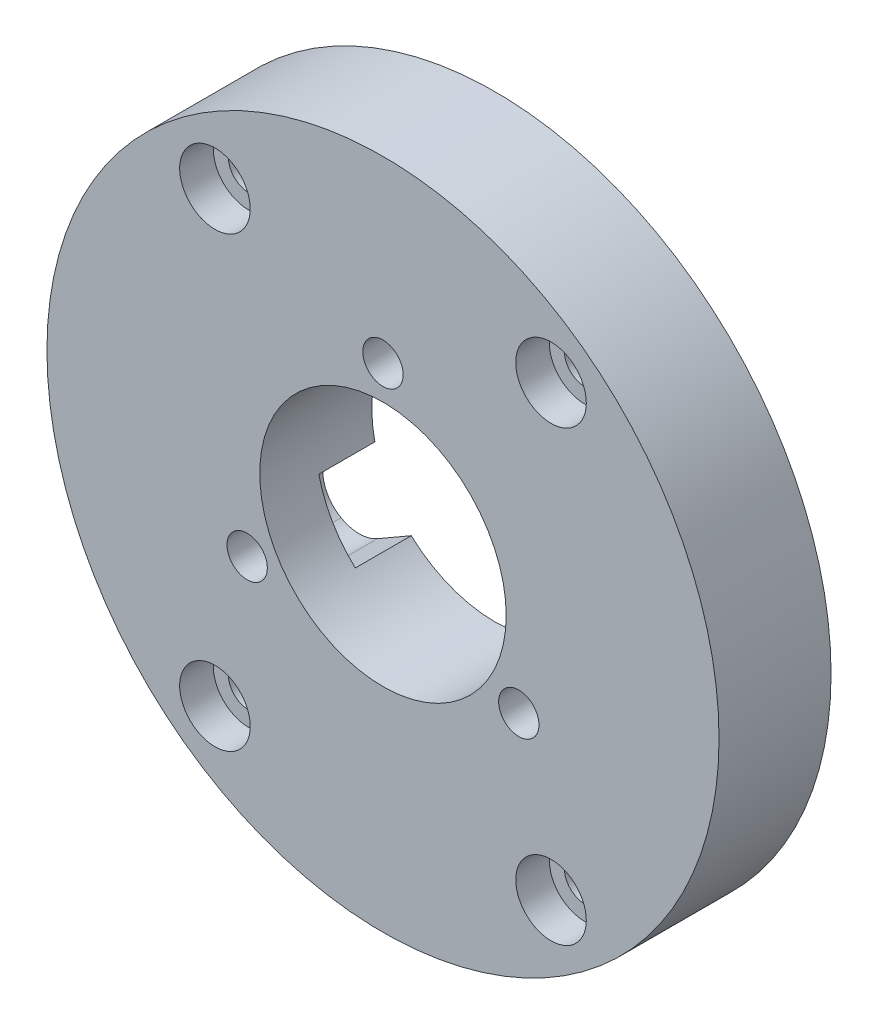
ISO-10303-21;
HEADER;
FILE_DESCRIPTION(('STEP AP214'),'2;1');
FILE_NAME('part.step','',(''),(''),'','','');
FILE_SCHEMA(('AUTOMOTIVE_DESIGN { 1 0 10303 214 1 1 1 1 }'));
ENDSEC;
DATA;
#1=APPLICATION_CONTEXT('core data for automotive mechanical design processes');
#2=APPLICATION_PROTOCOL_DEFINITION('international standard','automotive_design',2000,#1);
#3=PRODUCT_CONTEXT('',#1,'mechanical');
#4=PRODUCT('Part','Part','',(#3));
#5=PRODUCT_RELATED_PRODUCT_CATEGORY('part','',(#4));
#6=PRODUCT_DEFINITION_FORMATION('','',#4);
#7=PRODUCT_DEFINITION_CONTEXT('part definition',#1,'design');
#8=PRODUCT_DEFINITION('design','',#6,#7);
#9=PRODUCT_DEFINITION_SHAPE('','',#8);
#10=(LENGTH_UNIT() NAMED_UNIT(*) SI_UNIT(.MILLI.,.METRE.));
#11=(NAMED_UNIT(*) PLANE_ANGLE_UNIT() SI_UNIT($,.RADIAN.));
#12=(NAMED_UNIT(*) SI_UNIT($,.STERADIAN.) SOLID_ANGLE_UNIT());
#13=UNCERTAINTY_MEASURE_WITH_UNIT(LENGTH_MEASURE(1.E-05),#10,'distance_accuracy_value','');
#14=(GEOMETRIC_REPRESENTATION_CONTEXT(3) GLOBAL_UNCERTAINTY_ASSIGNED_CONTEXT((#13)) GLOBAL_UNIT_ASSIGNED_CONTEXT((#10,
#11,#12)) REPRESENTATION_CONTEXT('',''));
#15=CARTESIAN_POINT('',(0.,0.,0.));
#16=DIRECTION('',(0.,0.,1.));
#17=DIRECTION('',(1.,0.,0.));
#18=AXIS2_PLACEMENT_3D('',#15,#16,#17);
#19=CARTESIAN_POINT('',(0.,0.,0.));
#20=DIRECTION('',(0.,0.,1.));
#21=DIRECTION('',(1.,0.,0.));
#22=AXIS2_PLACEMENT_3D('',#19,#20,#21);
#23=PLANE('',#22);
#24=CARTESIAN_POINT('',(0.,0.,0.));
#25=DIRECTION('',(0.,0.,1.));
#26=DIRECTION('',(1.,0.,0.));
#27=AXIS2_PLACEMENT_3D('',#24,#25,#26);
#28=CIRCLE('',#27,30.);
#29=CARTESIAN_POINT('',(30.,0.,0.));
#30=VERTEX_POINT('',#29);
#31=EDGE_CURVE('E65',#30,#30,#28,.T.);
#32=ORIENTED_EDGE('',*,*,#31,.F.);
#33=EDGE_LOOP('',(#32));
#34=FACE_BOUND('',#33,.T.);
#35=CARTESIAN_POINT('',(15.,-20.,0.));
#36=DIRECTION('',(0.,0.,1.));
#37=DIRECTION('',(1.,0.,0.));
#38=AXIS2_PLACEMENT_3D('',#35,#36,#37);
#39=CIRCLE('',#38,1.8);
#40=CARTESIAN_POINT('',(16.8,-20.,0.));
#41=VERTEX_POINT('',#40);
#42=EDGE_CURVE('E288',#41,#41,#39,.F.);
#43=ORIENTED_EDGE('',*,*,#42,.F.);
#44=EDGE_LOOP('',(#43));
#45=FACE_BOUND('',#44,.T.);
#46=CARTESIAN_POINT('',(-15.,20.,0.));
#47=DIRECTION('',(0.,0.,1.));
#48=DIRECTION('',(1.,0.,0.));
#49=AXIS2_PLACEMENT_3D('',#46,#47,#48);
#50=CIRCLE('',#49,1.8);
#51=CARTESIAN_POINT('',(-13.2,20.,0.));
#52=VERTEX_POINT('',#51);
#53=EDGE_CURVE('E281',#52,#52,#50,.F.);
#54=ORIENTED_EDGE('',*,*,#53,.F.);
#55=EDGE_LOOP('',(#54));
#56=FACE_BOUND('',#55,.T.);
#57=CARTESIAN_POINT('',(15.,20.,0.));
#58=DIRECTION('',(0.,0.,1.));
#59=DIRECTION('',(1.,0.,0.));
#60=AXIS2_PLACEMENT_3D('',#57,#58,#59);
#61=CIRCLE('',#60,1.8);
#62=CARTESIAN_POINT('',(16.8,20.,0.));
#63=VERTEX_POINT('',#62);
#64=EDGE_CURVE('E284',#63,#63,#61,.F.);
#65=ORIENTED_EDGE('',*,*,#64,.F.);
#66=EDGE_LOOP('',(#65));
#67=FACE_BOUND('',#66,.T.);
#68=CARTESIAN_POINT('',(-15.,-20.,0.));
#69=DIRECTION('',(0.,0.,1.));
#70=DIRECTION('',(1.,0.,0.));
#71=AXIS2_PLACEMENT_3D('',#68,#69,#70);
#72=CIRCLE('',#71,1.8);
#73=CARTESIAN_POINT('',(-13.2,-20.,0.));
#74=VERTEX_POINT('',#73);
#75=EDGE_CURVE('E285',#74,#74,#72,.F.);
#76=ORIENTED_EDGE('',*,*,#75,.F.);
#77=EDGE_LOOP('',(#76));
#78=FACE_BOUND('',#77,.T.);
#79=CARTESIAN_POINT('',(0.,0.,0.));
#80=DIRECTION('',(0.,0.,1.));
#81=DIRECTION('',(1.,0.,0.));
#82=AXIS2_PLACEMENT_3D('',#79,#80,#81);
#83=CIRCLE('',#82,11.);
#84=CARTESIAN_POINT('',(7.47599582463377,-8.06904495154528,0.));
#85=VERTEX_POINT('',#84);
#86=CARTESIAN_POINT('',(-7.47599582463366,-8.06904495154539,0.));
#87=VERTEX_POINT('',#86);
#88=EDGE_CURVE('E254',#85,#87,#83,.F.);
#89=ORIENTED_EDGE('',*,*,#88,.F.);
#90=DIRECTION('',(-0.866025403784443,0.499999999999992,0.));
#91=VECTOR('',#90,1.);
#92=CARTESIAN_POINT('',(-1.62499999999997,-2.81458256229944,0.));
#93=LINE('',#92,#91);
#94=CARTESIAN_POINT('',(10.413102363555,-9.76478420243002,0.));
#95=VERTEX_POINT('',#94);
#96=EDGE_CURVE('E193',#95,#85,#93,.T.);
#97=ORIENTED_EDGE('',*,*,#96,.F.);
#98=CARTESIAN_POINT('',(12.1228556529816,-7.00086602540401,0.));
#99=DIRECTION('',(0.,0.,-1.));
#100=DIRECTION('',(-1.,0.,0.));
#101=AXIS2_PLACEMENT_3D('',#98,#99,#100);
#102=CIRCLE('',#101,3.25);
#103=CARTESIAN_POINT('',(13.7486055952968,-9.81501547507124,0.));
#104=VERTEX_POINT('',#103);
#105=EDGE_CURVE('E293',#104,#95,#102,.T.);
#106=ORIENTED_EDGE('',*,*,#105,.F.);
#107=CARTESIAN_POINT('',(12.1243556529822,-6.99999999999989,0.));
#108=DIRECTION('',(0.,0.,-1.));
#109=DIRECTION('',(-1.,0.,0.));
#110=AXIS2_PLACEMENT_3D('',#107,#108,#109);
#111=CIRCLE('',#110,3.25);
#112=CARTESIAN_POINT('',(13.7493556529822,-4.18541743770045,0.));
#113=VERTEX_POINT('',#112);
#114=EDGE_CURVE('E235',#113,#104,#111,.T.);
#115=ORIENTED_EDGE('',*,*,#114,.F.);
#116=DIRECTION('',(-0.866025403784443,0.499999999999992,0.));
#117=VECTOR('',#116,1.);
#118=CARTESIAN_POINT('',(1.62499999999998,2.81458256229944,0.));
#119=LINE('',#118,#117);
#120=CARTESIAN_POINT('',(10.7259958246337,-2.4398798269464,0.));
#121=VERTEX_POINT('',#120);
#122=EDGE_CURVE('E202',#113,#121,#119,.T.);
#123=ORIENTED_EDGE('',*,*,#122,.T.);
#124=CARTESIAN_POINT('',(3.25,10.5089247784919,0.));
#125=VERTEX_POINT('',#124);
#126=EDGE_CURVE('E250',#125,#121,#83,.F.);
#127=ORIENTED_EDGE('',*,*,#126,.F.);
#128=DIRECTION('',(0.,-1.,0.));
#129=VECTOR('',#128,1.);
#130=CARTESIAN_POINT('',(3.25,0.,0.));
#131=LINE('',#130,#129);
#132=CARTESIAN_POINT('',(3.25,14.,0.));
#133=VERTEX_POINT('',#132);
#134=EDGE_CURVE('E203',#133,#125,#131,.T.);
#135=ORIENTED_EDGE('',*,*,#134,.F.);
#136=CARTESIAN_POINT('',(0.,14.,0.));
#137=DIRECTION('',(0.,0.,-1.));
#138=DIRECTION('',(-1.,0.,0.));
#139=AXIS2_PLACEMENT_3D('',#136,#137,#138);
#140=CIRCLE('',#139,3.25);
#141=CARTESIAN_POINT('',(-3.25,14.,0.));
#142=VERTEX_POINT('',#141);
#143=EDGE_CURVE('E298',#142,#133,#140,.T.);
#144=ORIENTED_EDGE('',*,*,#143,.F.);
#145=DIRECTION('',(0.,-1.,0.));
#146=VECTOR('',#145,1.);
#147=CARTESIAN_POINT('',(-3.25,0.,0.));
#148=LINE('',#147,#146);
#149=CARTESIAN_POINT('',(-3.25,10.5089247784919,0.));
#150=VERTEX_POINT('',#149);
#151=EDGE_CURVE('E213',#142,#150,#148,.T.);
#152=ORIENTED_EDGE('',*,*,#151,.T.);
#153=CARTESIAN_POINT('',(-10.7259958246337,-2.43987982694655,0.));
#154=VERTEX_POINT('',#153);
#155=EDGE_CURVE('E249',#154,#150,#83,.F.);
#156=ORIENTED_EDGE('',*,*,#155,.F.);
#157=DIRECTION('',(0.866025403784436,0.500000000000004,0.));
#158=VECTOR('',#157,1.);
#159=CARTESIAN_POINT('',(-1.62500000000001,2.81458256229942,0.));
#160=LINE('',#159,#158);
#161=CARTESIAN_POINT('',(-13.6646023635555,-4.13648510323546,0.));
#162=VERTEX_POINT('',#161);
#163=EDGE_CURVE('E192',#162,#154,#160,.T.);
#164=ORIENTED_EDGE('',*,*,#163,.F.);
#165=CARTESIAN_POINT('',(-12.1258556529827,-6.99913397459594,0.));
#166=DIRECTION('',(0.,0.,-1.));
#167=DIRECTION('',(-1.,0.,0.));
#168=AXIS2_PLACEMENT_3D('',#165,#166,#167);
#169=CIRCLE('',#168,3.25);
#170=CARTESIAN_POINT('',(-13.7501055952862,-9.81414944967364,0.));
#171=VERTEX_POINT('',#170);
#172=EDGE_CURVE('E184',#171,#162,#169,.T.);
#173=ORIENTED_EDGE('',*,*,#172,.F.);
#174=CARTESIAN_POINT('',(-12.1243556529821,-7.00000000000006,0.));
#175=DIRECTION('',(0.,0.,-1.));
#176=DIRECTION('',(-1.,0.,0.));
#177=AXIS2_PLACEMENT_3D('',#174,#175,#176);
#178=CIRCLE('',#177,3.25);
#179=CARTESIAN_POINT('',(-10.4993556529821,-9.81458256229948,0.));
#180=VERTEX_POINT('',#179);
#181=EDGE_CURVE('E163',#180,#171,#178,.T.);
#182=ORIENTED_EDGE('',*,*,#181,.F.);
#183=DIRECTION('',(0.866025403784436,0.500000000000004,0.));
#184=VECTOR('',#183,1.);
#185=CARTESIAN_POINT('',(1.62500000000001,-2.81458256229942,0.));
#186=LINE('',#185,#184);
#187=EDGE_CURVE('E173',#180,#87,#186,.T.);
#188=ORIENTED_EDGE('',*,*,#187,.T.);
#189=EDGE_LOOP('',(#89,#97,#106,#115,#123,#127,#135,#144,#152,#156,#164,#173,#182,#188));
#190=FACE_BOUND('',#189,.T.);
#191=ADVANCED_FACE('F56',(#34,#45,#56,#67,#78,#190),#23,.F.);
#192=CARTESIAN_POINT('',(0.,14.,5.));
#193=DIRECTION('',(0.,0.,-1.));
#194=DIRECTION('',(-1.,0.,0.));
#195=AXIS2_PLACEMENT_3D('',#192,#193,#194);
#196=CYLINDRICAL_SURFACE('',#195,3.25);
#197=ORIENTED_EDGE('',*,*,#143,.T.);
#198=DIRECTION('',(0.,0.,-1.));
#199=VECTOR('',#198,1.);
#200=CARTESIAN_POINT('',(3.25,14.,14.107047615902));
#201=LINE('',#200,#199);
#202=CARTESIAN_POINT('',(3.25,14.,5.));
#203=VERTEX_POINT('',#202);
#204=EDGE_CURVE('E205',#203,#133,#201,.T.);
#205=ORIENTED_EDGE('',*,*,#204,.F.);
#206=CARTESIAN_POINT('',(0.,14.,5.));
#207=DIRECTION('',(0.,0.,-1.));
#208=DIRECTION('',(-1.,0.,0.));
#209=AXIS2_PLACEMENT_3D('',#206,#207,#208);
#210=CIRCLE('',#209,3.25);
#211=CARTESIAN_POINT('',(-3.25,14.,5.));
#212=VERTEX_POINT('',#211);
#213=EDGE_CURVE('E294',#212,#203,#210,.T.);
#214=ORIENTED_EDGE('',*,*,#213,.F.);
#215=DIRECTION('',(0.,0.,-1.));
#216=VECTOR('',#215,1.);
#217=CARTESIAN_POINT('',(-3.25,14.,14.107047615902));
#218=LINE('',#217,#216);
#219=EDGE_CURVE('E216',#212,#142,#218,.T.);
#220=ORIENTED_EDGE('',*,*,#219,.T.);
#221=EDGE_LOOP('',(#197,#205,#214,#220));
#222=FACE_BOUND('',#221,.T.);
#223=ADVANCED_FACE('F355',(#222),#196,.F.);
#224=CARTESIAN_POINT('',(0.,0.,-0.000999999999999265));
#225=DIRECTION('',(0.,0.,1.));
#226=DIRECTION('',(1.,0.,0.));
#227=AXIS2_PLACEMENT_3D('',#224,#225,#226);
#228=CYLINDRICAL_SURFACE('',#227,11.);
#229=CARTESIAN_POINT('',(0.,0.,10.));
#230=DIRECTION('',(0.,0.,1.));
#231=DIRECTION('',(1.,0.,0.));
#232=AXIS2_PLACEMENT_3D('',#229,#230,#231);
#233=CIRCLE('',#232,11.);
#234=CARTESIAN_POINT('',(11.,0.,10.));
#235=VERTEX_POINT('',#234);
#236=EDGE_CURVE('E244',#235,#235,#233,.T.);
#237=ORIENTED_EDGE('',*,*,#236,.T.);
#238=EDGE_LOOP('',(#237));
#239=FACE_BOUND('',#238,.T.);
#240=CARTESIAN_POINT('',(0.,0.,5.));
#241=DIRECTION('',(0.,0.,-1.));
#242=DIRECTION('',(-1.,0.,0.));
#243=AXIS2_PLACEMENT_3D('',#240,#241,#242);
#244=CIRCLE('',#243,11.);
#245=CARTESIAN_POINT('',(7.47599582463377,-8.06904495154528,5.));
#246=VERTEX_POINT('',#245);
#247=CARTESIAN_POINT('',(10.7259958246337,-2.4398798269464,5.));
#248=VERTEX_POINT('',#247);
#249=EDGE_CURVE('E73',#246,#248,#244,.F.);
#250=ORIENTED_EDGE('',*,*,#249,.F.);
#251=DIRECTION('',(0.,0.,-1.));
#252=VECTOR('',#251,1.);
#253=CARTESIAN_POINT('',(7.47599582463377,-8.06904495154528,14.107047615902));
#254=LINE('',#253,#252);
#255=EDGE_CURVE('E197',#246,#85,#254,.T.);
#256=ORIENTED_EDGE('',*,*,#255,.T.);
#257=ORIENTED_EDGE('',*,*,#88,.T.);
#258=DIRECTION('',(0.,0.,-1.));
#259=VECTOR('',#258,1.);
#260=CARTESIAN_POINT('',(-7.47599582463366,-8.06904495154539,14.107047615902));
#261=LINE('',#260,#259);
#262=CARTESIAN_POINT('',(-7.47599582463366,-8.06904495154539,5.));
#263=VERTEX_POINT('',#262);
#264=EDGE_CURVE('E176',#263,#87,#261,.T.);
#265=ORIENTED_EDGE('',*,*,#264,.F.);
#266=CARTESIAN_POINT('',(0.,0.,5.));
#267=DIRECTION('',(0.,0.,-1.));
#268=DIRECTION('',(-1.,0.,0.));
#269=AXIS2_PLACEMENT_3D('',#266,#267,#268);
#270=CIRCLE('',#269,11.);
#271=CARTESIAN_POINT('',(-10.7259958246337,-2.43987982694655,5.));
#272=VERTEX_POINT('',#271);
#273=EDGE_CURVE('E247',#272,#263,#270,.F.);
#274=ORIENTED_EDGE('',*,*,#273,.F.);
#275=DIRECTION('',(0.,0.,-1.));
#276=VECTOR('',#275,1.);
#277=CARTESIAN_POINT('',(-10.7259958246337,-2.43987982694655,14.107047615902));
#278=LINE('',#277,#276);
#279=EDGE_CURVE('E223',#272,#154,#278,.T.);
#280=ORIENTED_EDGE('',*,*,#279,.T.);
#281=ORIENTED_EDGE('',*,*,#155,.T.);
#282=DIRECTION('',(0.,0.,-1.));
#283=VECTOR('',#282,1.);
#284=CARTESIAN_POINT('',(-3.25,10.5089247784919,14.107047615902));
#285=LINE('',#284,#283);
#286=CARTESIAN_POINT('',(-3.25,10.5089247784919,5.));
#287=VERTEX_POINT('',#286);
#288=EDGE_CURVE('E212',#287,#150,#285,.T.);
#289=ORIENTED_EDGE('',*,*,#288,.F.);
#290=CARTESIAN_POINT('',(0.,0.,5.));
#291=DIRECTION('',(0.,0.,-1.));
#292=DIRECTION('',(-1.,0.,0.));
#293=AXIS2_PLACEMENT_3D('',#290,#291,#292);
#294=CIRCLE('',#293,11.);
#295=CARTESIAN_POINT('',(3.25,10.5089247784919,5.));
#296=VERTEX_POINT('',#295);
#297=EDGE_CURVE('E80',#296,#287,#294,.F.);
#298=ORIENTED_EDGE('',*,*,#297,.F.);
#299=DIRECTION('',(0.,0.,-1.));
#300=VECTOR('',#299,1.);
#301=CARTESIAN_POINT('',(3.25,10.5089247784919,14.107047615902));
#302=LINE('',#301,#300);
#303=EDGE_CURVE('E207',#296,#125,#302,.T.);
#304=ORIENTED_EDGE('',*,*,#303,.T.);
#305=ORIENTED_EDGE('',*,*,#126,.T.);
#306=DIRECTION('',(0.,0.,-1.));
#307=VECTOR('',#306,1.);
#308=CARTESIAN_POINT('',(10.7259958246337,-2.4398798269464,14.107047615902));
#309=LINE('',#308,#307);
#310=EDGE_CURVE('E232',#248,#121,#309,.T.);
#311=ORIENTED_EDGE('',*,*,#310,.F.);
#312=EDGE_LOOP('',(#250,#256,#257,#265,#274,#280,#281,#289,#298,#304,#305,#311));
#313=FACE_BOUND('',#312,.T.);
#314=ADVANCED_FACE('F345',(#239,#313),#228,.F.);
#315=CARTESIAN_POINT('',(15.,-20.,-0.000999999999999265));
#316=DIRECTION('',(0.,0.,1.));
#317=DIRECTION('',(1.,0.,0.));
#318=AXIS2_PLACEMENT_3D('',#315,#316,#317);
#319=CYLINDRICAL_SURFACE('',#318,1.8);
#320=ORIENTED_EDGE('',*,*,#42,.T.);
#321=EDGE_LOOP('',(#320));
#322=FACE_BOUND('',#321,.T.);
#323=CARTESIAN_POINT('',(15.,-20.,7.));
#324=DIRECTION('',(0.,0.,1.));
#325=DIRECTION('',(1.,0.,0.));
#326=AXIS2_PLACEMENT_3D('',#323,#324,#325);
#327=CIRCLE('',#326,1.8);
#328=CARTESIAN_POINT('',(16.8,-20.,7.));
#329=VERTEX_POINT('',#328);
#330=EDGE_CURVE('E60',#329,#329,#327,.F.);
#331=ORIENTED_EDGE('',*,*,#330,.F.);
#332=EDGE_LOOP('',(#331));
#333=FACE_BOUND('',#332,.T.);
#334=ADVANCED_FACE('F342',(#322,#333),#319,.F.);
#335=CARTESIAN_POINT('',(-15.,20.,-0.000999999999999265));
#336=DIRECTION('',(0.,0.,1.));
#337=DIRECTION('',(1.,0.,0.));
#338=AXIS2_PLACEMENT_3D('',#335,#336,#337);
#339=CYLINDRICAL_SURFACE('',#338,1.8);
#340=ORIENTED_EDGE('',*,*,#53,.T.);
#341=EDGE_LOOP('',(#340));
#342=FACE_BOUND('',#341,.T.);
#343=CARTESIAN_POINT('',(-15.,20.,7.));
#344=DIRECTION('',(0.,0.,1.));
#345=DIRECTION('',(1.,0.,0.));
#346=AXIS2_PLACEMENT_3D('',#343,#344,#345);
#347=CIRCLE('',#346,1.8);
#348=CARTESIAN_POINT('',(-13.2,20.,7.));
#349=VERTEX_POINT('',#348);
#350=EDGE_CURVE('E333',#349,#349,#347,.F.);
#351=ORIENTED_EDGE('',*,*,#350,.F.);
#352=EDGE_LOOP('',(#351));
#353=FACE_BOUND('',#352,.T.);
#354=ADVANCED_FACE('F344',(#342,#353),#339,.F.);
#355=CARTESIAN_POINT('',(15.,20.,-0.000999999999999265));
#356=DIRECTION('',(0.,0.,1.));
#357=DIRECTION('',(1.,0.,0.));
#358=AXIS2_PLACEMENT_3D('',#355,#356,#357);
#359=CYLINDRICAL_SURFACE('',#358,1.8);
#360=ORIENTED_EDGE('',*,*,#64,.T.);
#361=EDGE_LOOP('',(#360));
#362=FACE_BOUND('',#361,.T.);
#363=CARTESIAN_POINT('',(15.,20.,7.));
#364=DIRECTION('',(0.,0.,1.));
#365=DIRECTION('',(1.,0.,0.));
#366=AXIS2_PLACEMENT_3D('',#363,#364,#365);
#367=CIRCLE('',#366,1.8);
#368=CARTESIAN_POINT('',(16.8,20.,7.));
#369=VERTEX_POINT('',#368);
#370=EDGE_CURVE('E331',#369,#369,#367,.F.);
#371=ORIENTED_EDGE('',*,*,#370,.F.);
#372=EDGE_LOOP('',(#371));
#373=FACE_BOUND('',#372,.T.);
#374=ADVANCED_FACE('F352',(#362,#373),#359,.F.);
#375=CARTESIAN_POINT('',(-15.,-20.,-0.000999999999999265));
#376=DIRECTION('',(0.,0.,1.));
#377=DIRECTION('',(1.,0.,0.));
#378=AXIS2_PLACEMENT_3D('',#375,#376,#377);
#379=CYLINDRICAL_SURFACE('',#378,1.8);
#380=ORIENTED_EDGE('',*,*,#75,.T.);
#381=EDGE_LOOP('',(#380));
#382=FACE_BOUND('',#381,.T.);
#383=CARTESIAN_POINT('',(-15.,-20.,7.));
#384=DIRECTION('',(0.,0.,1.));
#385=DIRECTION('',(1.,0.,0.));
#386=AXIS2_PLACEMENT_3D('',#383,#384,#385);
#387=CIRCLE('',#386,1.8);
#388=CARTESIAN_POINT('',(-13.2,-20.,7.));
#389=VERTEX_POINT('',#388);
#390=EDGE_CURVE('E278',#389,#389,#387,.F.);
#391=ORIENTED_EDGE('',*,*,#390,.F.);
#392=EDGE_LOOP('',(#391));
#393=FACE_BOUND('',#392,.T.);
#394=ADVANCED_FACE('F379',(#382,#393),#379,.F.);
#395=CARTESIAN_POINT('',(-12.1243556529815,-7.00000000000035,-0.000999999999999265));
#396=DIRECTION('',(0.,0.,1.));
#397=DIRECTION('',(1.,0.,0.));
#398=AXIS2_PLACEMENT_3D('',#395,#396,#397);
#399=CYLINDRICAL_SURFACE('',#398,1.8000000000008);
#400=CARTESIAN_POINT('',(-12.1243556529815,-7.00000000000035,10.));
#401=DIRECTION('',(0.,0.,1.));
#402=DIRECTION('',(1.,0.,0.));
#403=AXIS2_PLACEMENT_3D('',#400,#401,#402);
#404=CIRCLE('',#403,1.8000000000008);
#405=CARTESIAN_POINT('',(-10.3243556529807,-7.00000000000035,10.));
#406=VERTEX_POINT('',#405);
#407=EDGE_CURVE('E316',#406,#406,#404,.T.);
#408=ORIENTED_EDGE('',*,*,#407,.T.);
#409=EDGE_LOOP('',(#408));
#410=FACE_BOUND('',#409,.T.);
#411=CARTESIAN_POINT('',(-12.1243556529815,-7.00000000000035,5.));
#412=DIRECTION('',(0.,0.,-1.));
#413=DIRECTION('',(-1.,0.,0.));
#414=AXIS2_PLACEMENT_3D('',#411,#412,#413);
#415=CIRCLE('',#414,1.8000000000008);
#416=CARTESIAN_POINT('',(-13.9243556529823,-7.00000000000035,5.));
#417=VERTEX_POINT('',#416);
#418=EDGE_CURVE('E318',#417,#417,#415,.F.);
#419=ORIENTED_EDGE('',*,*,#418,.F.);
#420=EDGE_LOOP('',(#419));
#421=FACE_BOUND('',#420,.T.);
#422=ADVANCED_FACE('F375',(#410,#421),#399,.F.);
#423=CARTESIAN_POINT('',(12.1243556529827,-6.99999999999966,-0.000999999999999265));
#424=DIRECTION('',(0.,0.,1.));
#425=DIRECTION('',(1.,0.,0.));
#426=AXIS2_PLACEMENT_3D('',#423,#424,#425);
#427=CYLINDRICAL_SURFACE('',#426,1.80000000000053);
#428=CARTESIAN_POINT('',(12.1243556529827,-6.99999999999966,10.));
#429=DIRECTION('',(0.,0.,1.));
#430=DIRECTION('',(1.,0.,0.));
#431=AXIS2_PLACEMENT_3D('',#428,#429,#430);
#432=CIRCLE('',#431,1.80000000000053);
#433=CARTESIAN_POINT('',(13.9243556529833,-6.99999999999966,10.));
#434=VERTEX_POINT('',#433);
#435=EDGE_CURVE('E313',#434,#434,#432,.T.);
#436=ORIENTED_EDGE('',*,*,#435,.T.);
#437=EDGE_LOOP('',(#436));
#438=FACE_BOUND('',#437,.T.);
#439=CARTESIAN_POINT('',(12.1243556529827,-6.99999999999966,5.));
#440=DIRECTION('',(0.,0.,-1.));
#441=DIRECTION('',(-1.,0.,0.));
#442=AXIS2_PLACEMENT_3D('',#439,#440,#441);
#443=CIRCLE('',#442,1.80000000000053);
#444=CARTESIAN_POINT('',(10.3243556529822,-6.99999999999966,5.));
#445=VERTEX_POINT('',#444);
#446=EDGE_CURVE('E324',#445,#445,#443,.F.);
#447=ORIENTED_EDGE('',*,*,#446,.F.);
#448=EDGE_LOOP('',(#447));
#449=FACE_BOUND('',#448,.T.);
#450=ADVANCED_FACE('F378',(#438,#449),#427,.F.);
#451=CARTESIAN_POINT('',(0.,14.,-0.000999999999999265));
#452=DIRECTION('',(0.,0.,1.));
#453=DIRECTION('',(1.,0.,0.));
#454=AXIS2_PLACEMENT_3D('',#451,#452,#453);
#455=CYLINDRICAL_SURFACE('',#454,1.8);
#456=CARTESIAN_POINT('',(0.,14.,10.));
#457=DIRECTION('',(0.,0.,1.));
#458=DIRECTION('',(1.,0.,0.));
#459=AXIS2_PLACEMENT_3D('',#456,#457,#458);
#460=CIRCLE('',#459,1.8);
#461=CARTESIAN_POINT('',(1.8,14.,10.));
#462=VERTEX_POINT('',#461);
#463=EDGE_CURVE('E310',#462,#462,#460,.T.);
#464=ORIENTED_EDGE('',*,*,#463,.T.);
#465=EDGE_LOOP('',(#464));
#466=FACE_BOUND('',#465,.T.);
#467=CARTESIAN_POINT('',(0.,14.,5.));
#468=DIRECTION('',(0.,0.,-1.));
#469=DIRECTION('',(-1.,0.,0.));
#470=AXIS2_PLACEMENT_3D('',#467,#468,#469);
#471=CIRCLE('',#470,1.8);
#472=CARTESIAN_POINT('',(-1.8,14.,5.));
#473=VERTEX_POINT('',#472);
#474=EDGE_CURVE('E297',#473,#473,#471,.F.);
#475=ORIENTED_EDGE('',*,*,#474,.F.);
#476=EDGE_LOOP('',(#475));
#477=FACE_BOUND('',#476,.T.);
#478=ADVANCED_FACE('F383',(#466,#477),#455,.F.);
#479=CARTESIAN_POINT('',(0.,0.,10.));
#480=DIRECTION('',(0.,0.,-1.));
#481=DIRECTION('',(-1.,0.,0.));
#482=AXIS2_PLACEMENT_3D('',#479,#480,#481);
#483=CYLINDRICAL_SURFACE('',#482,30.);
#484=CARTESIAN_POINT('',(0.,0.,10.));
#485=DIRECTION('',(0.,0.,1.));
#486=DIRECTION('',(1.,0.,0.));
#487=AXIS2_PLACEMENT_3D('',#484,#485,#486);
#488=CIRCLE('',#487,30.);
#489=CARTESIAN_POINT('',(30.,0.,10.));
#490=VERTEX_POINT('',#489);
#491=EDGE_CURVE('E12',#490,#490,#488,.T.);
#492=ORIENTED_EDGE('',*,*,#491,.F.);
#493=EDGE_LOOP('',(#492));
#494=FACE_BOUND('',#493,.T.);
#495=ORIENTED_EDGE('',*,*,#31,.T.);
#496=EDGE_LOOP('',(#495));
#497=FACE_BOUND('',#496,.T.);
#498=ADVANCED_FACE('F58',(#494,#497),#483,.T.);
#499=CARTESIAN_POINT('',(0.,0.,10.));
#500=DIRECTION('',(0.,0.,1.));
#501=DIRECTION('',(1.,0.,0.));
#502=AXIS2_PLACEMENT_3D('',#499,#500,#501);
#503=PLANE('',#502);
#504=ORIENTED_EDGE('',*,*,#236,.F.);
#505=EDGE_LOOP('',(#504));
#506=FACE_BOUND('',#505,.T.);
#507=CARTESIAN_POINT('',(-15.,-20.,10.));
#508=DIRECTION('',(0.,0.,1.));
#509=DIRECTION('',(1.,0.,0.));
#510=AXIS2_PLACEMENT_3D('',#507,#508,#509);
#511=CIRCLE('',#510,3.15);
#512=CARTESIAN_POINT('',(-11.85,-20.,10.));
#513=VERTEX_POINT('',#512);
#514=EDGE_CURVE('E253',#513,#513,#511,.T.);
#515=ORIENTED_EDGE('',*,*,#514,.F.);
#516=EDGE_LOOP('',(#515));
#517=FACE_BOUND('',#516,.T.);
#518=CARTESIAN_POINT('',(15.,-20.,10.));
#519=DIRECTION('',(0.,0.,1.));
#520=DIRECTION('',(1.,0.,0.));
#521=AXIS2_PLACEMENT_3D('',#518,#519,#520);
#522=CIRCLE('',#521,3.15);
#523=CARTESIAN_POINT('',(18.15,-20.,10.));
#524=VERTEX_POINT('',#523);
#525=EDGE_CURVE('E267',#524,#524,#522,.T.);
#526=ORIENTED_EDGE('',*,*,#525,.F.);
#527=EDGE_LOOP('',(#526));
#528=FACE_BOUND('',#527,.T.);
#529=CARTESIAN_POINT('',(15.,20.,10.));
#530=DIRECTION('',(0.,0.,1.));
#531=DIRECTION('',(1.,0.,0.));
#532=AXIS2_PLACEMENT_3D('',#529,#530,#531);
#533=CIRCLE('',#532,3.15);
#534=CARTESIAN_POINT('',(18.15,20.,10.));
#535=VERTEX_POINT('',#534);
#536=EDGE_CURVE('E261',#535,#535,#533,.T.);
#537=ORIENTED_EDGE('',*,*,#536,.F.);
#538=EDGE_LOOP('',(#537));
#539=FACE_BOUND('',#538,.T.);
#540=CARTESIAN_POINT('',(-15.,20.,10.));
#541=DIRECTION('',(0.,0.,1.));
#542=DIRECTION('',(1.,0.,0.));
#543=AXIS2_PLACEMENT_3D('',#540,#541,#542);
#544=CIRCLE('',#543,3.15);
#545=CARTESIAN_POINT('',(-11.85,20.,10.));
#546=VERTEX_POINT('',#545);
#547=EDGE_CURVE('E260',#546,#546,#544,.T.);
#548=ORIENTED_EDGE('',*,*,#547,.F.);
#549=EDGE_LOOP('',(#548));
#550=FACE_BOUND('',#549,.T.);
#551=ORIENTED_EDGE('',*,*,#463,.F.);
#552=EDGE_LOOP('',(#551));
#553=FACE_BOUND('',#552,.T.);
#554=ORIENTED_EDGE('',*,*,#435,.F.);
#555=EDGE_LOOP('',(#554));
#556=FACE_BOUND('',#555,.T.);
#557=ORIENTED_EDGE('',*,*,#407,.F.);
#558=EDGE_LOOP('',(#557));
#559=FACE_BOUND('',#558,.T.);
#560=ORIENTED_EDGE('',*,*,#491,.T.);
#561=EDGE_LOOP('',(#560));
#562=FACE_BOUND('',#561,.T.);
#563=ADVANCED_FACE('F370',(#506,#517,#528,#539,#550,#553,#556,#559,#562),#503,.T.);
#564=CARTESIAN_POINT('',(0.,14.,5.));
#565=DIRECTION('',(0.,0.,-1.));
#566=DIRECTION('',(-1.,0.,0.));
#567=AXIS2_PLACEMENT_3D('',#564,#565,#566);
#568=PLANE('',#567);
#569=ORIENTED_EDGE('',*,*,#297,.T.);
#570=DIRECTION('',(0.,1.,0.));
#571=VECTOR('',#570,1.);
#572=CARTESIAN_POINT('',(-3.25,0.,5.));
#573=LINE('',#572,#571);
#574=EDGE_CURVE('E206',#287,#212,#573,.T.);
#575=ORIENTED_EDGE('',*,*,#574,.T.);
#576=ORIENTED_EDGE('',*,*,#213,.T.);
#577=DIRECTION('',(0.,1.,0.));
#578=VECTOR('',#577,1.);
#579=CARTESIAN_POINT('',(3.25,0.,5.));
#580=LINE('',#579,#578);
#581=EDGE_CURVE('E196',#296,#203,#580,.T.);
#582=ORIENTED_EDGE('',*,*,#581,.F.);
#583=EDGE_LOOP('',(#569,#575,#576,#582));
#584=FACE_BOUND('',#583,.T.);
#585=ORIENTED_EDGE('',*,*,#474,.T.);
#586=EDGE_LOOP('',(#585));
#587=FACE_BOUND('',#586,.T.);
#588=ADVANCED_FACE('F373',(#584,#587),#568,.T.);
#589=CARTESIAN_POINT('',(12.1228556529816,-7.00086602540401,5.));
#590=DIRECTION('',(0.,0.,-1.));
#591=DIRECTION('',(-1.,0.,0.));
#592=AXIS2_PLACEMENT_3D('',#589,#590,#591);
#593=PLANE('',#592);
#594=ORIENTED_EDGE('',*,*,#249,.T.);
#595=DIRECTION('',(0.866025403784443,-0.499999999999992,0.));
#596=VECTOR('',#595,1.);
#597=CARTESIAN_POINT('',(1.62499999999998,2.81458256229944,5.));
#598=LINE('',#597,#596);
#599=CARTESIAN_POINT('',(13.7493556529822,-4.18541743770045,5.));
#600=VERTEX_POINT('',#599);
#601=EDGE_CURVE('E228',#248,#600,#598,.T.);
#602=ORIENTED_EDGE('',*,*,#601,.T.);
#603=CARTESIAN_POINT('',(12.1243556529822,-6.99999999999989,5.));
#604=DIRECTION('',(0.,0.,-1.));
#605=DIRECTION('',(-1.,0.,0.));
#606=AXIS2_PLACEMENT_3D('',#603,#604,#605);
#607=CIRCLE('',#606,3.25);
#608=CARTESIAN_POINT('',(13.7486055952968,-9.81501547507124,5.));
#609=VERTEX_POINT('',#608);
#610=EDGE_CURVE('E231',#609,#600,#607,.F.);
#611=ORIENTED_EDGE('',*,*,#610,.F.);
#612=CARTESIAN_POINT('',(12.1228556529816,-7.00086602540401,5.));
#613=DIRECTION('',(0.,0.,-1.));
#614=DIRECTION('',(-1.,0.,0.));
#615=AXIS2_PLACEMENT_3D('',#612,#613,#614);
#616=CIRCLE('',#615,3.25);
#617=CARTESIAN_POINT('',(10.413102363555,-9.76478420243002,5.));
#618=VERTEX_POINT('',#617);
#619=EDGE_CURVE('E305',#609,#618,#616,.T.);
#620=ORIENTED_EDGE('',*,*,#619,.T.);
#621=DIRECTION('',(0.866025403784443,-0.499999999999992,0.));
#622=VECTOR('',#621,1.);
#623=CARTESIAN_POINT('',(-1.62499999999997,-2.81458256229944,5.));
#624=LINE('',#623,#622);
#625=EDGE_CURVE('E199',#246,#618,#624,.T.);
#626=ORIENTED_EDGE('',*,*,#625,.F.);
#627=EDGE_LOOP('',(#594,#602,#611,#620,#626));
#628=FACE_BOUND('',#627,.T.);
#629=ORIENTED_EDGE('',*,*,#446,.T.);
#630=EDGE_LOOP('',(#629));
#631=FACE_BOUND('',#630,.T.);
#632=ADVANCED_FACE('F392',(#628,#631),#593,.T.);
#633=CARTESIAN_POINT('',(12.1228556529816,-7.00086602540401,5.));
#634=DIRECTION('',(0.,0.,-1.));
#635=DIRECTION('',(-1.,0.,0.));
#636=AXIS2_PLACEMENT_3D('',#633,#634,#635);
#637=CYLINDRICAL_SURFACE('',#636,3.25);
#638=ORIENTED_EDGE('',*,*,#105,.T.);
#639=DIRECTION('',(0.,0.,-1.));
#640=VECTOR('',#639,1.);
#641=CARTESIAN_POINT('',(10.413102363555,-9.76478420243002,14.107047615902));
#642=LINE('',#641,#640);
#643=EDGE_CURVE('E195',#618,#95,#642,.T.);
#644=ORIENTED_EDGE('',*,*,#643,.F.);
#645=ORIENTED_EDGE('',*,*,#619,.F.);
#646=DIRECTION('',(0.,0.,-1.));
#647=VECTOR('',#646,1.);
#648=CARTESIAN_POINT('',(13.7486055952968,-9.81501547507124,14.107047615902));
#649=LINE('',#648,#647);
#650=EDGE_CURVE('E239',#609,#104,#649,.T.);
#651=ORIENTED_EDGE('',*,*,#650,.T.);
#652=EDGE_LOOP('',(#638,#644,#645,#651));
#653=FACE_BOUND('',#652,.T.);
#654=ADVANCED_FACE('F388',(#653),#637,.F.);
#655=CARTESIAN_POINT('',(-12.1258556529827,-6.99913397459594,5.));
#656=DIRECTION('',(0.,0.,-1.));
#657=DIRECTION('',(-1.,0.,0.));
#658=AXIS2_PLACEMENT_3D('',#655,#656,#657);
#659=PLANE('',#658);
#660=ORIENTED_EDGE('',*,*,#273,.T.);
#661=DIRECTION('',(-0.866025403784436,-0.500000000000004,0.));
#662=VECTOR('',#661,1.);
#663=CARTESIAN_POINT('',(1.62500000000001,-2.81458256229942,5.));
#664=LINE('',#663,#662);
#665=CARTESIAN_POINT('',(-10.4993556529821,-9.81458256229948,5.));
#666=VERTEX_POINT('',#665);
#667=EDGE_CURVE('E189',#263,#666,#664,.T.);
#668=ORIENTED_EDGE('',*,*,#667,.T.);
#669=CARTESIAN_POINT('',(-12.1243556529821,-7.00000000000006,5.));
#670=DIRECTION('',(0.,0.,-1.));
#671=DIRECTION('',(-1.,0.,0.));
#672=AXIS2_PLACEMENT_3D('',#669,#670,#671);
#673=CIRCLE('',#672,3.25);
#674=CARTESIAN_POINT('',(-13.7501055952862,-9.81414944967364,5.));
#675=VERTEX_POINT('',#674);
#676=EDGE_CURVE('E166',#675,#666,#673,.F.);
#677=ORIENTED_EDGE('',*,*,#676,.F.);
#678=CARTESIAN_POINT('',(-12.1258556529827,-6.99913397459594,5.));
#679=DIRECTION('',(0.,0.,-1.));
#680=DIRECTION('',(-1.,0.,0.));
#681=AXIS2_PLACEMENT_3D('',#678,#679,#680);
#682=CIRCLE('',#681,3.25);
#683=CARTESIAN_POINT('',(-13.6646023635555,-4.13648510323546,5.));
#684=VERTEX_POINT('',#683);
#685=EDGE_CURVE('E301',#675,#684,#682,.T.);
#686=ORIENTED_EDGE('',*,*,#685,.T.);
#687=DIRECTION('',(-0.866025403784436,-0.500000000000004,0.));
#688=VECTOR('',#687,1.);
#689=CARTESIAN_POINT('',(-1.62500000000001,2.81458256229942,5.));
#690=LINE('',#689,#688);
#691=EDGE_CURVE('E217',#272,#684,#690,.T.);
#692=ORIENTED_EDGE('',*,*,#691,.F.);
#693=EDGE_LOOP('',(#660,#668,#677,#686,#692));
#694=FACE_BOUND('',#693,.T.);
#695=ORIENTED_EDGE('',*,*,#418,.T.);
#696=EDGE_LOOP('',(#695));
#697=FACE_BOUND('',#696,.T.);
#698=ADVANCED_FACE('F391',(#694,#697),#659,.T.);
#699=CARTESIAN_POINT('',(-12.1258556529827,-6.99913397459594,5.));
#700=DIRECTION('',(0.,0.,-1.));
#701=DIRECTION('',(-1.,0.,0.));
#702=AXIS2_PLACEMENT_3D('',#699,#700,#701);
#703=CYLINDRICAL_SURFACE('',#702,3.25);
#704=ORIENTED_EDGE('',*,*,#172,.T.);
#705=DIRECTION('',(0.,0.,-1.));
#706=VECTOR('',#705,1.);
#707=CARTESIAN_POINT('',(-13.6646023635555,-4.13648510323546,14.107047615902));
#708=LINE('',#707,#706);
#709=EDGE_CURVE('E222',#684,#162,#708,.T.);
#710=ORIENTED_EDGE('',*,*,#709,.F.);
#711=ORIENTED_EDGE('',*,*,#685,.F.);
#712=DIRECTION('',(0.,0.,-1.));
#713=VECTOR('',#712,1.);
#714=CARTESIAN_POINT('',(-13.7501055952862,-9.81414944967364,14.107047615902));
#715=LINE('',#714,#713);
#716=EDGE_CURVE('E170',#675,#171,#715,.T.);
#717=ORIENTED_EDGE('',*,*,#716,.T.);
#718=EDGE_LOOP('',(#704,#710,#711,#717));
#719=FACE_BOUND('',#718,.T.);
#720=ADVANCED_FACE('F397',(#719),#703,.F.);
#721=CARTESIAN_POINT('',(-15.,-20.,7.));
#722=DIRECTION('',(0.,0.,1.));
#723=DIRECTION('',(1.,0.,0.));
#724=AXIS2_PLACEMENT_3D('',#721,#722,#723);
#725=PLANE('',#724);
#726=CARTESIAN_POINT('',(-15.,-20.,7.));
#727=DIRECTION('',(0.,0.,1.));
#728=DIRECTION('',(1.,0.,0.));
#729=AXIS2_PLACEMENT_3D('',#726,#727,#728);
#730=CIRCLE('',#729,3.15);
#731=CARTESIAN_POINT('',(-11.85,-20.,7.));
#732=VERTEX_POINT('',#731);
#733=EDGE_CURVE('E270',#732,#732,#730,.T.);
#734=ORIENTED_EDGE('',*,*,#733,.T.);
#735=EDGE_LOOP('',(#734));
#736=FACE_BOUND('',#735,.T.);
#737=ORIENTED_EDGE('',*,*,#390,.T.);
#738=EDGE_LOOP('',(#737));
#739=FACE_BOUND('',#738,.T.);
#740=ADVANCED_FACE('F400',(#736,#739),#725,.T.);
#741=CARTESIAN_POINT('',(-15.,-20.,7.));
#742=DIRECTION('',(0.,0.,1.));
#743=DIRECTION('',(1.,0.,0.));
#744=AXIS2_PLACEMENT_3D('',#741,#742,#743);
#745=CYLINDRICAL_SURFACE('',#744,3.15);
#746=ORIENTED_EDGE('',*,*,#733,.F.);
#747=EDGE_LOOP('',(#746));
#748=FACE_BOUND('',#747,.T.);
#749=ORIENTED_EDGE('',*,*,#514,.T.);
#750=EDGE_LOOP('',(#749));
#751=FACE_BOUND('',#750,.T.);
#752=ADVANCED_FACE('F466',(#748,#751),#745,.F.);
#753=CARTESIAN_POINT('',(15.,20.,7.));
#754=DIRECTION('',(0.,0.,1.));
#755=DIRECTION('',(1.,0.,0.));
#756=AXIS2_PLACEMENT_3D('',#753,#754,#755);
#757=PLANE('',#756);
#758=CARTESIAN_POINT('',(15.,20.,7.));
#759=DIRECTION('',(0.,0.,1.));
#760=DIRECTION('',(1.,0.,0.));
#761=AXIS2_PLACEMENT_3D('',#758,#759,#760);
#762=CIRCLE('',#761,3.15);
#763=CARTESIAN_POINT('',(18.15,20.,7.));
#764=VERTEX_POINT('',#763);
#765=EDGE_CURVE('E257',#764,#764,#762,.T.);
#766=ORIENTED_EDGE('',*,*,#765,.T.);
#767=EDGE_LOOP('',(#766));
#768=FACE_BOUND('',#767,.T.);
#769=ORIENTED_EDGE('',*,*,#370,.T.);
#770=EDGE_LOOP('',(#769));
#771=FACE_BOUND('',#770,.T.);
#772=ADVANCED_FACE('F462',(#768,#771),#757,.T.);
#773=CARTESIAN_POINT('',(15.,20.,7.));
#774=DIRECTION('',(0.,0.,1.));
#775=DIRECTION('',(1.,0.,0.));
#776=AXIS2_PLACEMENT_3D('',#773,#774,#775);
#777=CYLINDRICAL_SURFACE('',#776,3.15);
#778=ORIENTED_EDGE('',*,*,#765,.F.);
#779=EDGE_LOOP('',(#778));
#780=FACE_BOUND('',#779,.T.);
#781=ORIENTED_EDGE('',*,*,#536,.T.);
#782=EDGE_LOOP('',(#781));
#783=FACE_BOUND('',#782,.T.);
#784=ADVANCED_FACE('F465',(#780,#783),#777,.F.);
#785=CARTESIAN_POINT('',(-15.,20.,7.));
#786=DIRECTION('',(0.,0.,1.));
#787=DIRECTION('',(1.,0.,0.));
#788=AXIS2_PLACEMENT_3D('',#785,#786,#787);
#789=PLANE('',#788);
#790=CARTESIAN_POINT('',(-15.,20.,7.));
#791=DIRECTION('',(0.,0.,1.));
#792=DIRECTION('',(1.,0.,0.));
#793=AXIS2_PLACEMENT_3D('',#790,#791,#792);
#794=CIRCLE('',#793,3.15);
#795=CARTESIAN_POINT('',(-11.85,20.,7.));
#796=VERTEX_POINT('',#795);
#797=EDGE_CURVE('E275',#796,#796,#794,.T.);
#798=ORIENTED_EDGE('',*,*,#797,.T.);
#799=EDGE_LOOP('',(#798));
#800=FACE_BOUND('',#799,.T.);
#801=ORIENTED_EDGE('',*,*,#350,.T.);
#802=EDGE_LOOP('',(#801));
#803=FACE_BOUND('',#802,.T.);
#804=ADVANCED_FACE('F470',(#800,#803),#789,.T.);
#805=CARTESIAN_POINT('',(-15.,20.,7.));
#806=DIRECTION('',(0.,0.,1.));
#807=DIRECTION('',(1.,0.,0.));
#808=AXIS2_PLACEMENT_3D('',#805,#806,#807);
#809=CYLINDRICAL_SURFACE('',#808,3.15);
#810=ORIENTED_EDGE('',*,*,#797,.F.);
#811=EDGE_LOOP('',(#810));
#812=FACE_BOUND('',#811,.T.);
#813=ORIENTED_EDGE('',*,*,#547,.T.);
#814=EDGE_LOOP('',(#813));
#815=FACE_BOUND('',#814,.T.);
#816=ADVANCED_FACE('F474',(#812,#815),#809,.F.);
#817=CARTESIAN_POINT('',(15.,-20.,7.));
#818=DIRECTION('',(0.,0.,1.));
#819=DIRECTION('',(1.,0.,0.));
#820=AXIS2_PLACEMENT_3D('',#817,#818,#819);
#821=PLANE('',#820);
#822=CARTESIAN_POINT('',(15.,-20.,7.));
#823=DIRECTION('',(0.,0.,1.));
#824=DIRECTION('',(1.,0.,0.));
#825=AXIS2_PLACEMENT_3D('',#822,#823,#824);
#826=CIRCLE('',#825,3.15);
#827=CARTESIAN_POINT('',(18.15,-20.,7.));
#828=VERTEX_POINT('',#827);
#829=EDGE_CURVE('E264',#828,#828,#826,.T.);
#830=ORIENTED_EDGE('',*,*,#829,.T.);
#831=EDGE_LOOP('',(#830));
#832=FACE_BOUND('',#831,.T.);
#833=ORIENTED_EDGE('',*,*,#330,.T.);
#834=EDGE_LOOP('',(#833));
#835=FACE_BOUND('',#834,.T.);
#836=ADVANCED_FACE('F340',(#832,#835),#821,.T.);
#837=CARTESIAN_POINT('',(15.,-20.,7.));
#838=DIRECTION('',(0.,0.,1.));
#839=DIRECTION('',(1.,0.,0.));
#840=AXIS2_PLACEMENT_3D('',#837,#838,#839);
#841=CYLINDRICAL_SURFACE('',#840,3.15);
#842=ORIENTED_EDGE('',*,*,#829,.F.);
#843=EDGE_LOOP('',(#842));
#844=FACE_BOUND('',#843,.T.);
#845=ORIENTED_EDGE('',*,*,#525,.T.);
#846=EDGE_LOOP('',(#845));
#847=FACE_BOUND('',#846,.T.);
#848=ADVANCED_FACE('F460',(#844,#847),#841,.F.);
#849=CARTESIAN_POINT('',(1.62499999999998,2.81458256229944,14.107047615902));
#850=DIRECTION('',(-0.499999999999992,-0.866025403784443,0.));
#851=DIRECTION('',(0.866025403784443,-0.499999999999992,0.));
#852=AXIS2_PLACEMENT_3D('',#849,#850,#851);
#853=PLANE('',#852);
#854=ORIENTED_EDGE('',*,*,#310,.T.);
#855=ORIENTED_EDGE('',*,*,#122,.F.);
#856=DIRECTION('',(0.,0.,-1.));
#857=VECTOR('',#856,1.);
#858=CARTESIAN_POINT('',(13.7493556529822,-4.18541743770045,14.107047615902));
#859=LINE('',#858,#857);
#860=EDGE_CURVE('E237',#600,#113,#859,.T.);
#861=ORIENTED_EDGE('',*,*,#860,.F.);
#862=ORIENTED_EDGE('',*,*,#601,.F.);
#863=EDGE_LOOP('',(#854,#855,#861,#862));
#864=FACE_BOUND('',#863,.T.);
#865=ADVANCED_FACE('F435',(#864),#853,.T.);
#866=CARTESIAN_POINT('',(12.1243556529822,-6.99999999999989,14.107047615902));
#867=DIRECTION('',(0.,0.,-1.));
#868=DIRECTION('',(-1.,0.,0.));
#869=AXIS2_PLACEMENT_3D('',#866,#867,#868);
#870=CYLINDRICAL_SURFACE('',#869,3.25);
#871=ORIENTED_EDGE('',*,*,#610,.T.);
#872=ORIENTED_EDGE('',*,*,#860,.T.);
#873=ORIENTED_EDGE('',*,*,#114,.T.);
#874=ORIENTED_EDGE('',*,*,#650,.F.);
#875=EDGE_LOOP('',(#871,#872,#873,#874));
#876=FACE_BOUND('',#875,.T.);
#877=ADVANCED_FACE('F429',(#876),#870,.F.);
#878=CARTESIAN_POINT('',(1.62500000000001,-2.81458256229942,14.107047615902));
#879=DIRECTION('',(-0.500000000000004,0.866025403784436,0.));
#880=DIRECTION('',(-0.866025403784436,-0.500000000000004,0.));
#881=AXIS2_PLACEMENT_3D('',#878,#879,#880);
#882=PLANE('',#881);
#883=ORIENTED_EDGE('',*,*,#264,.T.);
#884=ORIENTED_EDGE('',*,*,#187,.F.);
#885=DIRECTION('',(0.,0.,-1.));
#886=VECTOR('',#885,1.);
#887=CARTESIAN_POINT('',(-10.4993556529821,-9.81458256229948,14.107047615902));
#888=LINE('',#887,#886);
#889=EDGE_CURVE('E159',#666,#180,#888,.T.);
#890=ORIENTED_EDGE('',*,*,#889,.F.);
#891=ORIENTED_EDGE('',*,*,#667,.F.);
#892=EDGE_LOOP('',(#883,#884,#890,#891));
#893=FACE_BOUND('',#892,.T.);
#894=ADVANCED_FACE('F174',(#893),#882,.T.);
#895=CARTESIAN_POINT('',(-12.1243556529821,-7.00000000000006,14.107047615902));
#896=DIRECTION('',(0.,0.,-1.));
#897=DIRECTION('',(-1.,0.,0.));
#898=AXIS2_PLACEMENT_3D('',#895,#896,#897);
#899=CYLINDRICAL_SURFACE('',#898,3.25);
#900=ORIENTED_EDGE('',*,*,#676,.T.);
#901=ORIENTED_EDGE('',*,*,#889,.T.);
#902=ORIENTED_EDGE('',*,*,#181,.T.);
#903=ORIENTED_EDGE('',*,*,#716,.F.);
#904=EDGE_LOOP('',(#900,#901,#902,#903));
#905=FACE_BOUND('',#904,.T.);
#906=ADVANCED_FACE('F161',(#905),#899,.F.);
#907=CARTESIAN_POINT('',(-1.62500000000001,2.81458256229942,14.107047615902));
#908=DIRECTION('',(-0.500000000000004,0.866025403784436,0.));
#909=DIRECTION('',(-0.866025403784436,-0.500000000000004,0.));
#910=AXIS2_PLACEMENT_3D('',#907,#908,#909);
#911=PLANE('',#910);
#912=ORIENTED_EDGE('',*,*,#691,.T.);
#913=ORIENTED_EDGE('',*,*,#709,.T.);
#914=ORIENTED_EDGE('',*,*,#163,.T.);
#915=ORIENTED_EDGE('',*,*,#279,.F.);
#916=EDGE_LOOP('',(#912,#913,#914,#915));
#917=FACE_BOUND('',#916,.T.);
#918=ADVANCED_FACE('F450',(#917),#911,.F.);
#919=CARTESIAN_POINT('',(-3.25,0.,14.107047615902));
#920=DIRECTION('',(1.,0.,0.));
#921=DIRECTION('',(0.,0.,-1.));
#922=AXIS2_PLACEMENT_3D('',#919,#920,#921);
#923=PLANE('',#922);
#924=ORIENTED_EDGE('',*,*,#288,.T.);
#925=ORIENTED_EDGE('',*,*,#151,.F.);
#926=ORIENTED_EDGE('',*,*,#219,.F.);
#927=ORIENTED_EDGE('',*,*,#574,.F.);
#928=EDGE_LOOP('',(#924,#925,#926,#927));
#929=FACE_BOUND('',#928,.T.);
#930=ADVANCED_FACE('F415',(#929),#923,.T.);
#931=CARTESIAN_POINT('',(3.25,0.,14.107047615902));
#932=DIRECTION('',(1.,0.,0.));
#933=DIRECTION('',(0.,0.,-1.));
#934=AXIS2_PLACEMENT_3D('',#931,#932,#933);
#935=PLANE('',#934);
#936=ORIENTED_EDGE('',*,*,#581,.T.);
#937=ORIENTED_EDGE('',*,*,#204,.T.);
#938=ORIENTED_EDGE('',*,*,#134,.T.);
#939=ORIENTED_EDGE('',*,*,#303,.F.);
#940=EDGE_LOOP('',(#936,#937,#938,#939));
#941=FACE_BOUND('',#940,.T.);
#942=ADVANCED_FACE('F439',(#941),#935,.F.);
#943=CARTESIAN_POINT('',(-1.62499999999997,-2.81458256229944,14.107047615902));
#944=DIRECTION('',(-0.499999999999992,-0.866025403784443,0.));
#945=DIRECTION('',(0.866025403784443,-0.499999999999992,0.));
#946=AXIS2_PLACEMENT_3D('',#943,#944,#945);
#947=PLANE('',#946);
#948=ORIENTED_EDGE('',*,*,#625,.T.);
#949=ORIENTED_EDGE('',*,*,#643,.T.);
#950=ORIENTED_EDGE('',*,*,#96,.T.);
#951=ORIENTED_EDGE('',*,*,#255,.F.);
#952=EDGE_LOOP('',(#948,#949,#950,#951));
#953=FACE_BOUND('',#952,.T.);
#954=ADVANCED_FACE('F443',(#953),#947,.F.);
#955=CLOSED_SHELL('',(#191,#223,#314,#334,#354,#374,#394,#422,#450,#478,#498,#563,#588,#632,
#654,#698,#720,#740,#752,#772,#784,#804,#816,#836,#848,#865,#877,#894,#906,#918,#930,#942,#954));
#956=MANIFOLD_SOLID_BREP('B2',#955);
#957=ADVANCED_BREP_SHAPE_REPRESENTATION('',(#18,#956),#14);
#958=SHAPE_DEFINITION_REPRESENTATION(#9,#957);
ENDSEC;
END-ISO-10303-21;
